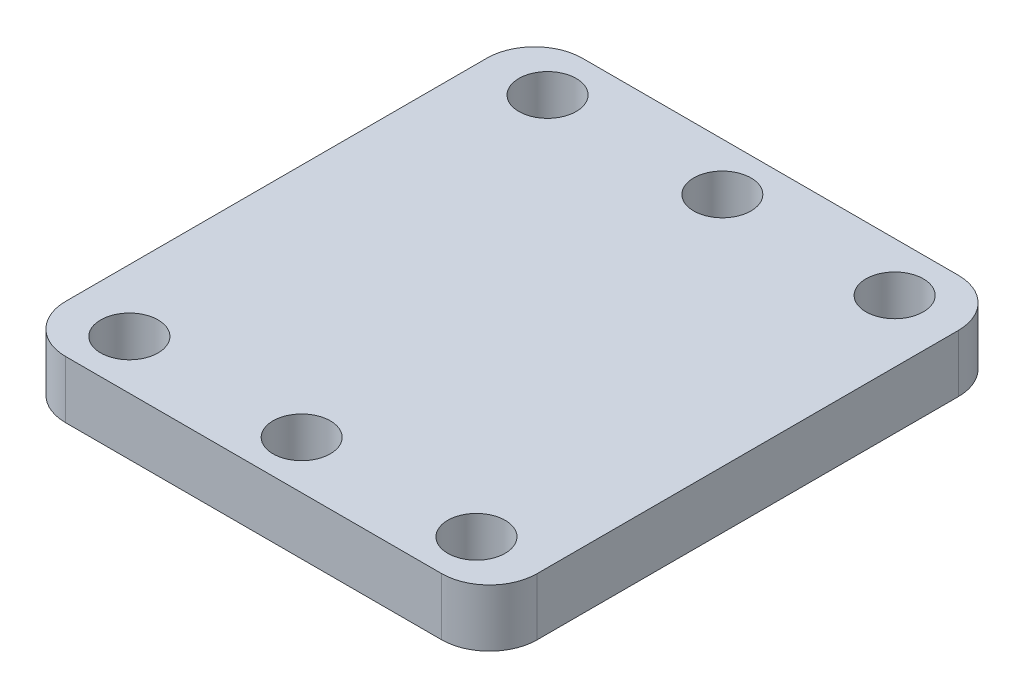
ISO-10303-21;
HEADER;
FILE_DESCRIPTION(('STEP AP214'),'2;1');
FILE_NAME('part.step','',(''),(''),'','','');
FILE_SCHEMA(('AUTOMOTIVE_DESIGN { 1 0 10303 214 1 1 1 1 }'));
ENDSEC;
DATA;
#1=APPLICATION_CONTEXT('core data for automotive mechanical design processes');
#2=APPLICATION_PROTOCOL_DEFINITION('international standard','automotive_design',2000,#1);
#3=PRODUCT_CONTEXT('',#1,'mechanical');
#4=PRODUCT('Part','Part','',(#3));
#5=PRODUCT_RELATED_PRODUCT_CATEGORY('part','',(#4));
#6=PRODUCT_DEFINITION_FORMATION('','',#4);
#7=PRODUCT_DEFINITION_CONTEXT('part definition',#1,'design');
#8=PRODUCT_DEFINITION('design','',#6,#7);
#9=PRODUCT_DEFINITION_SHAPE('','',#8);
#10=(LENGTH_UNIT() NAMED_UNIT(*) SI_UNIT(.MILLI.,.METRE.));
#11=(NAMED_UNIT(*) PLANE_ANGLE_UNIT() SI_UNIT($,.RADIAN.));
#12=(NAMED_UNIT(*) SI_UNIT($,.STERADIAN.) SOLID_ANGLE_UNIT());
#13=UNCERTAINTY_MEASURE_WITH_UNIT(LENGTH_MEASURE(1.E-05),#10,'distance_accuracy_value','');
#14=(GEOMETRIC_REPRESENTATION_CONTEXT(3) GLOBAL_UNCERTAINTY_ASSIGNED_CONTEXT((#13)) GLOBAL_UNIT_ASSIGNED_CONTEXT((#10,
#11,#12)) REPRESENTATION_CONTEXT('',''));
#15=CARTESIAN_POINT('',(0.,0.,0.));
#16=DIRECTION('',(0.,0.,1.));
#17=DIRECTION('',(1.,0.,0.));
#18=AXIS2_PLACEMENT_3D('',#15,#16,#17);
#19=CARTESIAN_POINT('',(-7.04433551406543,1.5,15.5448270475998));
#20=DIRECTION('',(0.,-1.,0.));
#21=DIRECTION('',(0.,0.,-1.));
#22=AXIS2_PLACEMENT_3D('',#19,#20,#21);
#23=PLANE('',#22);
#24=CARTESIAN_POINT('',(-7.04433551406543,1.5,15.5448270475998));
#25=DIRECTION('',(0.,1.,0.));
#26=DIRECTION('',(0.,0.,-1.));
#27=AXIS2_PLACEMENT_3D('',#24,#25,#26);
#28=CIRCLE('',#27,2.5);
#29=CARTESIAN_POINT('',(-9.54433551406543,1.5,15.5448270475998));
#30=VERTEX_POINT('',#29);
#31=CARTESIAN_POINT('',(-7.04433551406543,1.5,18.0448270475998));
#32=VERTEX_POINT('',#31);
#33=EDGE_CURVE('E145',#30,#32,#28,.T.);
#34=ORIENTED_EDGE('',*,*,#33,.T.);
#35=DIRECTION('',(1.,0.,0.));
#36=VECTOR('',#35,1.);
#37=CARTESIAN_POINT('',(-7.04433551406543,1.5,18.0448270475998));
#38=LINE('',#37,#36);
#39=CARTESIAN_POINT('',(12.6140404251522,1.5,18.0448270475998));
#40=VERTEX_POINT('',#39);
#41=EDGE_CURVE('E93',#32,#40,#38,.T.);
#42=ORIENTED_EDGE('',*,*,#41,.T.);
#43=CARTESIAN_POINT('',(12.6140404251522,1.5,15.5448270475998));
#44=DIRECTION('',(0.,1.,0.));
#45=DIRECTION('',(0.,0.,1.));
#46=AXIS2_PLACEMENT_3D('',#43,#44,#45);
#47=CIRCLE('',#46,2.5);
#48=CARTESIAN_POINT('',(15.1140404251522,1.5,15.5448270475998));
#49=VERTEX_POINT('',#48);
#50=EDGE_CURVE('E160',#40,#49,#47,.T.);
#51=ORIENTED_EDGE('',*,*,#50,.T.);
#52=DIRECTION('',(0.,0.,-1.));
#53=VECTOR('',#52,1.);
#54=CARTESIAN_POINT('',(15.1140404251522,1.5,-6.47651594065438));
#55=LINE('',#54,#53);
#56=CARTESIAN_POINT('',(15.1140404251522,1.5,-6.47651594065438));
#57=VERTEX_POINT('',#56);
#58=EDGE_CURVE('E173',#49,#57,#55,.T.);
#59=ORIENTED_EDGE('',*,*,#58,.T.);
#60=CARTESIAN_POINT('',(12.6140404251522,1.5,-6.47651594065438));
#61=DIRECTION('',(0.,1.,0.));
#62=DIRECTION('',(0.,0.,-1.));
#63=AXIS2_PLACEMENT_3D('',#60,#61,#62);
#64=CIRCLE('',#63,2.5);
#65=CARTESIAN_POINT('',(12.6140404251522,1.5,-8.97651594065438));
#66=VERTEX_POINT('',#65);
#67=EDGE_CURVE('E112',#57,#66,#64,.T.);
#68=ORIENTED_EDGE('',*,*,#67,.T.);
#69=DIRECTION('',(-1.,0.,0.));
#70=VECTOR('',#69,1.);
#71=CARTESIAN_POINT('',(-7.04433551406544,1.5,-8.97651594065438));
#72=LINE('',#71,#70);
#73=CARTESIAN_POINT('',(-7.04433551406544,1.5,-8.97651594065438));
#74=VERTEX_POINT('',#73);
#75=EDGE_CURVE('E106',#66,#74,#72,.T.);
#76=ORIENTED_EDGE('',*,*,#75,.T.);
#77=CARTESIAN_POINT('',(-7.04433551406544,1.5,-6.47651594065438));
#78=DIRECTION('',(0.,1.,0.));
#79=DIRECTION('',(0.,0.,1.));
#80=AXIS2_PLACEMENT_3D('',#77,#78,#79);
#81=CIRCLE('',#80,2.5);
#82=CARTESIAN_POINT('',(-9.54433551406544,1.5,-6.47651594065438));
#83=VERTEX_POINT('',#82);
#84=EDGE_CURVE('E110',#74,#83,#81,.T.);
#85=ORIENTED_EDGE('',*,*,#84,.T.);
#86=DIRECTION('',(0.,0.,1.));
#87=VECTOR('',#86,1.);
#88=CARTESIAN_POINT('',(-9.54433551406544,1.5,-6.47651594065438));
#89=LINE('',#88,#87);
#90=EDGE_CURVE('E50',#83,#30,#89,.T.);
#91=ORIENTED_EDGE('',*,*,#90,.T.);
#92=EDGE_LOOP('',(#34,#42,#51,#59,#68,#76,#85,#91));
#93=FACE_BOUND('',#92,.T.);
#94=CARTESIAN_POINT('',(2.78485245554341,1.5,-6.4658444465273));
#95=DIRECTION('',(0.,1.,0.));
#96=DIRECTION('',(0.,0.,1.));
#97=AXIS2_PLACEMENT_3D('',#94,#95,#96);
#98=CIRCLE('',#97,1.49820029080397);
#99=CARTESIAN_POINT('',(2.78485245554341,1.5,-4.96764415572333));
#100=VERTEX_POINT('',#99);
#101=EDGE_CURVE('E134',#100,#100,#98,.T.);
#102=ORIENTED_EDGE('',*,*,#101,.F.);
#103=EDGE_LOOP('',(#102));
#104=FACE_BOUND('',#103,.T.);
#105=CARTESIAN_POINT('',(2.78485245554341,1.5,15.5341555534727));
#106=DIRECTION('',(0.,1.,0.));
#107=DIRECTION('',(0.,0.,-1.));
#108=AXIS2_PLACEMENT_3D('',#105,#106,#107);
#109=CIRCLE('',#108,1.49820029080397);
#110=CARTESIAN_POINT('',(2.78485245554341,1.5,14.0359552626687));
#111=VERTEX_POINT('',#110);
#112=EDGE_CURVE('E182',#111,#111,#109,.T.);
#113=ORIENTED_EDGE('',*,*,#112,.F.);
#114=EDGE_LOOP('',(#113));
#115=FACE_BOUND('',#114,.T.);
#116=CARTESIAN_POINT('',(-6.29031227297148,1.5,-6.4004025871747));
#117=DIRECTION('',(0.,1.,0.));
#118=DIRECTION('',(0.,0.,1.));
#119=AXIS2_PLACEMENT_3D('',#116,#117,#118);
#120=CIRCLE('',#119,1.5);
#121=CARTESIAN_POINT('',(-6.29031227297148,1.5,-4.9004025871747));
#122=VERTEX_POINT('',#121);
#123=EDGE_CURVE('E188',#122,#122,#120,.T.);
#124=ORIENTED_EDGE('',*,*,#123,.F.);
#125=EDGE_LOOP('',(#124));
#126=FACE_BOUND('',#125,.T.);
#127=CARTESIAN_POINT('',(-6.29031227297148,1.5,15.4687136941201));
#128=DIRECTION('',(0.,1.,0.));
#129=DIRECTION('',(0.,0.,-1.));
#130=AXIS2_PLACEMENT_3D('',#127,#128,#129);
#131=CIRCLE('',#130,1.5);
#132=CARTESIAN_POINT('',(-6.29031227297148,1.5,13.9687136941201));
#133=VERTEX_POINT('',#132);
#134=EDGE_CURVE('E194',#133,#133,#131,.T.);
#135=ORIENTED_EDGE('',*,*,#134,.F.);
#136=EDGE_LOOP('',(#135));
#137=FACE_BOUND('',#136,.T.);
#138=CARTESIAN_POINT('',(11.8600171840583,1.5,15.4687136941201));
#139=DIRECTION('',(0.,1.,0.));
#140=DIRECTION('',(0.,0.,1.));
#141=AXIS2_PLACEMENT_3D('',#138,#139,#140);
#142=CIRCLE('',#141,1.5);
#143=CARTESIAN_POINT('',(11.8600171840583,1.5,16.9687136941201));
#144=VERTEX_POINT('',#143);
#145=EDGE_CURVE('E200',#144,#144,#142,.T.);
#146=ORIENTED_EDGE('',*,*,#145,.F.);
#147=EDGE_LOOP('',(#146));
#148=FACE_BOUND('',#147,.T.);
#149=CARTESIAN_POINT('',(11.8600171840583,1.5,-6.4004025871747));
#150=DIRECTION('',(0.,1.,0.));
#151=DIRECTION('',(0.,0.,-1.));
#152=AXIS2_PLACEMENT_3D('',#149,#150,#151);
#153=CIRCLE('',#152,1.5);
#154=CARTESIAN_POINT('',(11.8600171840583,1.5,-7.9004025871747));
#155=VERTEX_POINT('',#154);
#156=EDGE_CURVE('E206',#155,#155,#153,.T.);
#157=ORIENTED_EDGE('',*,*,#156,.F.);
#158=EDGE_LOOP('',(#157));
#159=FACE_BOUND('',#158,.T.);
#160=ADVANCED_FACE('F33',(#93,#104,#115,#126,#137,#148,#159),#23,.F.);
#161=CARTESIAN_POINT('',(-7.04433551406543,-1.5,15.5448270475998));
#162=DIRECTION('',(0.,-1.,0.));
#163=DIRECTION('',(0.,0.,-1.));
#164=AXIS2_PLACEMENT_3D('',#161,#162,#163);
#165=PLANE('',#164);
#166=CARTESIAN_POINT('',(11.8600171840583,-1.5,15.4687136941201));
#167=DIRECTION('',(0.,1.,0.));
#168=DIRECTION('',(0.,0.,1.));
#169=AXIS2_PLACEMENT_3D('',#166,#167,#168);
#170=CIRCLE('',#169,1.5);
#171=CARTESIAN_POINT('',(11.8600171840583,-1.5,16.9687136941201));
#172=VERTEX_POINT('',#171);
#173=EDGE_CURVE('E203',#172,#172,#170,.T.);
#174=ORIENTED_EDGE('',*,*,#173,.T.);
#175=EDGE_LOOP('',(#174));
#176=FACE_BOUND('',#175,.T.);
#177=CARTESIAN_POINT('',(-6.29031227297148,-1.5,-6.4004025871747));
#178=DIRECTION('',(0.,1.,0.));
#179=DIRECTION('',(0.,0.,1.));
#180=AXIS2_PLACEMENT_3D('',#177,#178,#179);
#181=CIRCLE('',#180,1.5);
#182=CARTESIAN_POINT('',(-6.29031227297148,-1.5,-4.9004025871747));
#183=VERTEX_POINT('',#182);
#184=EDGE_CURVE('E191',#183,#183,#181,.T.);
#185=ORIENTED_EDGE('',*,*,#184,.T.);
#186=EDGE_LOOP('',(#185));
#187=FACE_BOUND('',#186,.T.);
#188=CARTESIAN_POINT('',(2.78485245554341,-1.5,-6.4658444465273));
#189=DIRECTION('',(0.,1.,0.));
#190=DIRECTION('',(0.,0.,1.));
#191=AXIS2_PLACEMENT_3D('',#188,#189,#190);
#192=CIRCLE('',#191,1.49820029080397);
#193=CARTESIAN_POINT('',(2.78485245554341,-1.5,-4.96764415572333));
#194=VERTEX_POINT('',#193);
#195=EDGE_CURVE('E179',#194,#194,#192,.T.);
#196=ORIENTED_EDGE('',*,*,#195,.T.);
#197=EDGE_LOOP('',(#196));
#198=FACE_BOUND('',#197,.T.);
#199=CARTESIAN_POINT('',(-7.04433551406543,-1.5,15.5448270475998));
#200=DIRECTION('',(0.,1.,0.));
#201=DIRECTION('',(0.,0.,-1.));
#202=AXIS2_PLACEMENT_3D('',#199,#200,#201);
#203=CIRCLE('',#202,2.5);
#204=CARTESIAN_POINT('',(-9.54433551406543,-1.5,15.5448270475998));
#205=VERTEX_POINT('',#204);
#206=CARTESIAN_POINT('',(-7.04433551406543,-1.5,18.0448270475998));
#207=VERTEX_POINT('',#206);
#208=EDGE_CURVE('E130',#205,#207,#203,.T.);
#209=ORIENTED_EDGE('',*,*,#208,.F.);
#210=DIRECTION('',(0.,0.,1.));
#211=VECTOR('',#210,1.);
#212=CARTESIAN_POINT('',(-9.54433551406544,-1.5,-6.47651594065438));
#213=LINE('',#212,#211);
#214=CARTESIAN_POINT('',(-9.54433551406544,-1.5,-6.47651594065438));
#215=VERTEX_POINT('',#214);
#216=EDGE_CURVE('E85',#215,#205,#213,.T.);
#217=ORIENTED_EDGE('',*,*,#216,.F.);
#218=CARTESIAN_POINT('',(-7.04433551406544,-1.5,-6.47651594065438));
#219=DIRECTION('',(0.,1.,0.));
#220=DIRECTION('',(0.,0.,1.));
#221=AXIS2_PLACEMENT_3D('',#218,#219,#220);
#222=CIRCLE('',#221,2.5);
#223=CARTESIAN_POINT('',(-7.04433551406544,-1.5,-8.97651594065438));
#224=VERTEX_POINT('',#223);
#225=EDGE_CURVE('E79',#224,#215,#222,.T.);
#226=ORIENTED_EDGE('',*,*,#225,.F.);
#227=DIRECTION('',(-1.,0.,0.));
#228=VECTOR('',#227,1.);
#229=CARTESIAN_POINT('',(-7.04433551406544,-1.5,-8.97651594065438));
#230=LINE('',#229,#228);
#231=CARTESIAN_POINT('',(12.6140404251522,-1.5,-8.97651594065438));
#232=VERTEX_POINT('',#231);
#233=EDGE_CURVE('E120',#232,#224,#230,.T.);
#234=ORIENTED_EDGE('',*,*,#233,.F.);
#235=CARTESIAN_POINT('',(12.6140404251522,-1.5,-6.47651594065438));
#236=DIRECTION('',(0.,1.,0.));
#237=DIRECTION('',(0.,0.,-1.));
#238=AXIS2_PLACEMENT_3D('',#235,#236,#237);
#239=CIRCLE('',#238,2.5);
#240=CARTESIAN_POINT('',(15.1140404251522,-1.5,-6.47651594065438));
#241=VERTEX_POINT('',#240);
#242=EDGE_CURVE('E140',#241,#232,#239,.T.);
#243=ORIENTED_EDGE('',*,*,#242,.F.);
#244=DIRECTION('',(0.,0.,-1.));
#245=VECTOR('',#244,1.);
#246=CARTESIAN_POINT('',(15.1140404251522,-1.5,-6.47651594065438));
#247=LINE('',#246,#245);
#248=CARTESIAN_POINT('',(15.1140404251522,-1.5,15.5448270475998));
#249=VERTEX_POINT('',#248);
#250=EDGE_CURVE('E138',#249,#241,#247,.T.);
#251=ORIENTED_EDGE('',*,*,#250,.F.);
#252=CARTESIAN_POINT('',(12.6140404251522,-1.5,15.5448270475998));
#253=DIRECTION('',(0.,1.,0.));
#254=DIRECTION('',(0.,0.,1.));
#255=AXIS2_PLACEMENT_3D('',#252,#253,#254);
#256=CIRCLE('',#255,2.5);
#257=CARTESIAN_POINT('',(12.6140404251522,-1.5,18.0448270475998));
#258=VERTEX_POINT('',#257);
#259=EDGE_CURVE('E136',#258,#249,#256,.T.);
#260=ORIENTED_EDGE('',*,*,#259,.F.);
#261=DIRECTION('',(1.,0.,0.));
#262=VECTOR('',#261,1.);
#263=CARTESIAN_POINT('',(-7.04433551406543,-1.5,18.0448270475998));
#264=LINE('',#263,#262);
#265=EDGE_CURVE('E133',#207,#258,#264,.T.);
#266=ORIENTED_EDGE('',*,*,#265,.F.);
#267=EDGE_LOOP('',(#209,#217,#226,#234,#243,#251,#260,#266));
#268=FACE_BOUND('',#267,.T.);
#269=CARTESIAN_POINT('',(2.78485245554341,-1.5,15.5341555534727));
#270=DIRECTION('',(0.,1.,0.));
#271=DIRECTION('',(0.,0.,-1.));
#272=AXIS2_PLACEMENT_3D('',#269,#270,#271);
#273=CIRCLE('',#272,1.49820029080397);
#274=CARTESIAN_POINT('',(2.78485245554341,-1.5,14.0359552626687));
#275=VERTEX_POINT('',#274);
#276=EDGE_CURVE('E185',#275,#275,#273,.T.);
#277=ORIENTED_EDGE('',*,*,#276,.T.);
#278=EDGE_LOOP('',(#277));
#279=FACE_BOUND('',#278,.T.);
#280=CARTESIAN_POINT('',(-6.29031227297148,-1.5,15.4687136941201));
#281=DIRECTION('',(0.,1.,0.));
#282=DIRECTION('',(0.,0.,-1.));
#283=AXIS2_PLACEMENT_3D('',#280,#281,#282);
#284=CIRCLE('',#283,1.5);
#285=CARTESIAN_POINT('',(-6.29031227297148,-1.5,13.9687136941201));
#286=VERTEX_POINT('',#285);
#287=EDGE_CURVE('E197',#286,#286,#284,.T.);
#288=ORIENTED_EDGE('',*,*,#287,.T.);
#289=EDGE_LOOP('',(#288));
#290=FACE_BOUND('',#289,.T.);
#291=CARTESIAN_POINT('',(11.8600171840583,-1.5,-6.4004025871747));
#292=DIRECTION('',(0.,1.,0.));
#293=DIRECTION('',(0.,0.,-1.));
#294=AXIS2_PLACEMENT_3D('',#291,#292,#293);
#295=CIRCLE('',#294,1.5);
#296=CARTESIAN_POINT('',(11.8600171840583,-1.5,-7.9004025871747));
#297=VERTEX_POINT('',#296);
#298=EDGE_CURVE('E209',#297,#297,#295,.T.);
#299=ORIENTED_EDGE('',*,*,#298,.T.);
#300=EDGE_LOOP('',(#299));
#301=FACE_BOUND('',#300,.T.);
#302=ADVANCED_FACE('F164',(#176,#187,#198,#268,#279,#290,#301),#165,.T.);
#303=CARTESIAN_POINT('',(-7.04433551406543,1.5,15.5448270475998));
#304=DIRECTION('',(0.,-1.,0.));
#305=DIRECTION('',(0.,0.,-1.));
#306=AXIS2_PLACEMENT_3D('',#303,#304,#305);
#307=CYLINDRICAL_SURFACE('',#306,2.5);
#308=ORIENTED_EDGE('',*,*,#208,.T.);
#309=DIRECTION('',(0.,-1.,0.));
#310=VECTOR('',#309,1.);
#311=CARTESIAN_POINT('',(-7.04433551406543,1.5,18.0448270475998));
#312=LINE('',#311,#310);
#313=EDGE_CURVE('E11',#32,#207,#312,.T.);
#314=ORIENTED_EDGE('',*,*,#313,.F.);
#315=ORIENTED_EDGE('',*,*,#33,.F.);
#316=DIRECTION('',(0.,-1.,0.));
#317=VECTOR('',#316,1.);
#318=CARTESIAN_POINT('',(-9.54433551406543,1.5,15.5448270475998));
#319=LINE('',#318,#317);
#320=EDGE_CURVE('E126',#30,#205,#319,.T.);
#321=ORIENTED_EDGE('',*,*,#320,.T.);
#322=EDGE_LOOP('',(#308,#314,#315,#321));
#323=FACE_BOUND('',#322,.T.);
#324=ADVANCED_FACE('F35',(#323),#307,.T.);
#325=CARTESIAN_POINT('',(-7.04433551406543,1.5,18.0448270475998));
#326=DIRECTION('',(0.,0.,-1.));
#327=DIRECTION('',(-1.,0.,0.));
#328=AXIS2_PLACEMENT_3D('',#325,#326,#327);
#329=PLANE('',#328);
#330=ORIENTED_EDGE('',*,*,#265,.T.);
#331=DIRECTION('',(0.,-1.,0.));
#332=VECTOR('',#331,1.);
#333=CARTESIAN_POINT('',(12.6140404251522,1.5,18.0448270475998));
#334=LINE('',#333,#332);
#335=EDGE_CURVE('E42',#40,#258,#334,.T.);
#336=ORIENTED_EDGE('',*,*,#335,.F.);
#337=ORIENTED_EDGE('',*,*,#41,.F.);
#338=ORIENTED_EDGE('',*,*,#313,.T.);
#339=EDGE_LOOP('',(#330,#336,#337,#338));
#340=FACE_BOUND('',#339,.T.);
#341=ADVANCED_FACE('F241',(#340),#329,.F.);
#342=CARTESIAN_POINT('',(12.6140404251522,1.5,15.5448270475998));
#343=DIRECTION('',(0.,-1.,0.));
#344=DIRECTION('',(0.,0.,-1.));
#345=AXIS2_PLACEMENT_3D('',#342,#343,#344);
#346=CYLINDRICAL_SURFACE('',#345,2.5);
#347=ORIENTED_EDGE('',*,*,#259,.T.);
#348=DIRECTION('',(0.,-1.,0.));
#349=VECTOR('',#348,1.);
#350=CARTESIAN_POINT('',(15.1140404251522,1.5,15.5448270475998));
#351=LINE('',#350,#349);
#352=EDGE_CURVE('E152',#49,#249,#351,.T.);
#353=ORIENTED_EDGE('',*,*,#352,.F.);
#354=ORIENTED_EDGE('',*,*,#50,.F.);
#355=ORIENTED_EDGE('',*,*,#335,.T.);
#356=EDGE_LOOP('',(#347,#353,#354,#355));
#357=FACE_BOUND('',#356,.T.);
#358=ADVANCED_FACE('F158',(#357),#346,.T.);
#359=CARTESIAN_POINT('',(15.1140404251522,1.5,-6.47651594065438));
#360=DIRECTION('',(-1.,0.,0.));
#361=DIRECTION('',(0.,0.,1.));
#362=AXIS2_PLACEMENT_3D('',#359,#360,#361);
#363=PLANE('',#362);
#364=ORIENTED_EDGE('',*,*,#250,.T.);
#365=DIRECTION('',(0.,-1.,0.));
#366=VECTOR('',#365,1.);
#367=CARTESIAN_POINT('',(15.1140404251522,1.5,-6.47651594065438));
#368=LINE('',#367,#366);
#369=EDGE_CURVE('E149',#57,#241,#368,.T.);
#370=ORIENTED_EDGE('',*,*,#369,.F.);
#371=ORIENTED_EDGE('',*,*,#58,.F.);
#372=ORIENTED_EDGE('',*,*,#352,.T.);
#373=EDGE_LOOP('',(#364,#370,#371,#372));
#374=FACE_BOUND('',#373,.T.);
#375=ADVANCED_FACE('F169',(#374),#363,.F.);
#376=CARTESIAN_POINT('',(12.6140404251522,1.5,-6.47651594065438));
#377=DIRECTION('',(0.,-1.,0.));
#378=DIRECTION('',(0.,0.,-1.));
#379=AXIS2_PLACEMENT_3D('',#376,#377,#378);
#380=CYLINDRICAL_SURFACE('',#379,2.5);
#381=ORIENTED_EDGE('',*,*,#242,.T.);
#382=DIRECTION('',(0.,-1.,0.));
#383=VECTOR('',#382,1.);
#384=CARTESIAN_POINT('',(12.6140404251522,1.5,-8.97651594065438));
#385=LINE('',#384,#383);
#386=EDGE_CURVE('E121',#66,#232,#385,.T.);
#387=ORIENTED_EDGE('',*,*,#386,.F.);
#388=ORIENTED_EDGE('',*,*,#67,.F.);
#389=ORIENTED_EDGE('',*,*,#369,.T.);
#390=EDGE_LOOP('',(#381,#387,#388,#389));
#391=FACE_BOUND('',#390,.T.);
#392=ADVANCED_FACE('F172',(#391),#380,.T.);
#393=CARTESIAN_POINT('',(-7.04433551406544,1.5,-8.97651594065438));
#394=DIRECTION('',(0.,0.,1.));
#395=DIRECTION('',(1.,0.,0.));
#396=AXIS2_PLACEMENT_3D('',#393,#394,#395);
#397=PLANE('',#396);
#398=ORIENTED_EDGE('',*,*,#233,.T.);
#399=DIRECTION('',(0.,-1.,0.));
#400=VECTOR('',#399,1.);
#401=CARTESIAN_POINT('',(-7.04433551406544,1.5,-8.97651594065438));
#402=LINE('',#401,#400);
#403=EDGE_CURVE('E117',#74,#224,#402,.T.);
#404=ORIENTED_EDGE('',*,*,#403,.F.);
#405=ORIENTED_EDGE('',*,*,#75,.F.);
#406=ORIENTED_EDGE('',*,*,#386,.T.);
#407=EDGE_LOOP('',(#398,#404,#405,#406));
#408=FACE_BOUND('',#407,.T.);
#409=ADVANCED_FACE('F118',(#408),#397,.F.);
#410=CARTESIAN_POINT('',(-7.04433551406544,1.5,-6.47651594065438));
#411=DIRECTION('',(0.,-1.,0.));
#412=DIRECTION('',(0.,0.,-1.));
#413=AXIS2_PLACEMENT_3D('',#410,#411,#412);
#414=CYLINDRICAL_SURFACE('',#413,2.5);
#415=ORIENTED_EDGE('',*,*,#225,.T.);
#416=DIRECTION('',(0.,-1.,0.));
#417=VECTOR('',#416,1.);
#418=CARTESIAN_POINT('',(-9.54433551406544,1.5,-6.47651594065438));
#419=LINE('',#418,#417);
#420=EDGE_CURVE('E122',#83,#215,#419,.T.);
#421=ORIENTED_EDGE('',*,*,#420,.F.);
#422=ORIENTED_EDGE('',*,*,#84,.F.);
#423=ORIENTED_EDGE('',*,*,#403,.T.);
#424=EDGE_LOOP('',(#415,#421,#422,#423));
#425=FACE_BOUND('',#424,.T.);
#426=ADVANCED_FACE('F124',(#425),#414,.T.);
#427=CARTESIAN_POINT('',(-9.54433551406544,1.5,-6.47651594065438));
#428=DIRECTION('',(1.,0.,0.));
#429=DIRECTION('',(0.,0.,-1.));
#430=AXIS2_PLACEMENT_3D('',#427,#428,#429);
#431=PLANE('',#430);
#432=ORIENTED_EDGE('',*,*,#216,.T.);
#433=ORIENTED_EDGE('',*,*,#320,.F.);
#434=ORIENTED_EDGE('',*,*,#90,.F.);
#435=ORIENTED_EDGE('',*,*,#420,.T.);
#436=EDGE_LOOP('',(#432,#433,#434,#435));
#437=FACE_BOUND('',#436,.T.);
#438=ADVANCED_FACE('F229',(#437),#431,.F.);
#439=CARTESIAN_POINT('',(2.78485245554341,1.5,-6.4658444465273));
#440=DIRECTION('',(0.,-1.,0.));
#441=DIRECTION('',(0.,0.,-1.));
#442=AXIS2_PLACEMENT_3D('',#439,#440,#441);
#443=CYLINDRICAL_SURFACE('',#442,1.49820029080397);
#444=ORIENTED_EDGE('',*,*,#101,.T.);
#445=EDGE_LOOP('',(#444));
#446=FACE_BOUND('',#445,.T.);
#447=ORIENTED_EDGE('',*,*,#195,.F.);
#448=EDGE_LOOP('',(#447));
#449=FACE_BOUND('',#448,.T.);
#450=ADVANCED_FACE('F226',(#446,#449),#443,.F.);
#451=CARTESIAN_POINT('',(2.78485245554341,1.5,15.5341555534727));
#452=DIRECTION('',(0.,-1.,0.));
#453=DIRECTION('',(0.,0.,-1.));
#454=AXIS2_PLACEMENT_3D('',#451,#452,#453);
#455=CYLINDRICAL_SURFACE('',#454,1.49820029080397);
#456=ORIENTED_EDGE('',*,*,#112,.T.);
#457=EDGE_LOOP('',(#456));
#458=FACE_BOUND('',#457,.T.);
#459=ORIENTED_EDGE('',*,*,#276,.F.);
#460=EDGE_LOOP('',(#459));
#461=FACE_BOUND('',#460,.T.);
#462=ADVANCED_FACE('F305',(#458,#461),#455,.F.);
#463=CARTESIAN_POINT('',(-6.29031227297148,1.5,-6.4004025871747));
#464=DIRECTION('',(0.,-1.,0.));
#465=DIRECTION('',(0.,0.,-1.));
#466=AXIS2_PLACEMENT_3D('',#463,#464,#465);
#467=CYLINDRICAL_SURFACE('',#466,1.5);
#468=ORIENTED_EDGE('',*,*,#123,.T.);
#469=EDGE_LOOP('',(#468));
#470=FACE_BOUND('',#469,.T.);
#471=ORIENTED_EDGE('',*,*,#184,.F.);
#472=EDGE_LOOP('',(#471));
#473=FACE_BOUND('',#472,.T.);
#474=ADVANCED_FACE('F313',(#470,#473),#467,.F.);
#475=CARTESIAN_POINT('',(-6.29031227297148,1.5,15.4687136941201));
#476=DIRECTION('',(0.,-1.,0.));
#477=DIRECTION('',(0.,0.,-1.));
#478=AXIS2_PLACEMENT_3D('',#475,#476,#477);
#479=CYLINDRICAL_SURFACE('',#478,1.5);
#480=ORIENTED_EDGE('',*,*,#134,.T.);
#481=EDGE_LOOP('',(#480));
#482=FACE_BOUND('',#481,.T.);
#483=ORIENTED_EDGE('',*,*,#287,.F.);
#484=EDGE_LOOP('',(#483));
#485=FACE_BOUND('',#484,.T.);
#486=ADVANCED_FACE('F321',(#482,#485),#479,.F.);
#487=CARTESIAN_POINT('',(11.8600171840583,1.5,15.4687136941201));
#488=DIRECTION('',(0.,-1.,0.));
#489=DIRECTION('',(0.,0.,-1.));
#490=AXIS2_PLACEMENT_3D('',#487,#488,#489);
#491=CYLINDRICAL_SURFACE('',#490,1.5);
#492=ORIENTED_EDGE('',*,*,#145,.T.);
#493=EDGE_LOOP('',(#492));
#494=FACE_BOUND('',#493,.T.);
#495=ORIENTED_EDGE('',*,*,#173,.F.);
#496=EDGE_LOOP('',(#495));
#497=FACE_BOUND('',#496,.T.);
#498=ADVANCED_FACE('F330',(#494,#497),#491,.F.);
#499=CARTESIAN_POINT('',(11.8600171840583,1.5,-6.4004025871747));
#500=DIRECTION('',(0.,-1.,0.));
#501=DIRECTION('',(0.,0.,-1.));
#502=AXIS2_PLACEMENT_3D('',#499,#500,#501);
#503=CYLINDRICAL_SURFACE('',#502,1.5);
#504=ORIENTED_EDGE('',*,*,#156,.T.);
#505=EDGE_LOOP('',(#504));
#506=FACE_BOUND('',#505,.T.);
#507=ORIENTED_EDGE('',*,*,#298,.F.);
#508=EDGE_LOOP('',(#507));
#509=FACE_BOUND('',#508,.T.);
#510=ADVANCED_FACE('F215',(#506,#509),#503,.F.);
#511=CLOSED_SHELL('',(#160,#302,#324,#341,#358,#375,#392,#409,#426,#438,#450,#462,#474,#486,
#498,#510));
#512=MANIFOLD_SOLID_BREP('B2',#511);
#513=ADVANCED_BREP_SHAPE_REPRESENTATION('',(#18,#512),#14);
#514=SHAPE_DEFINITION_REPRESENTATION(#9,#513);
ENDSEC;
END-ISO-10303-21;
